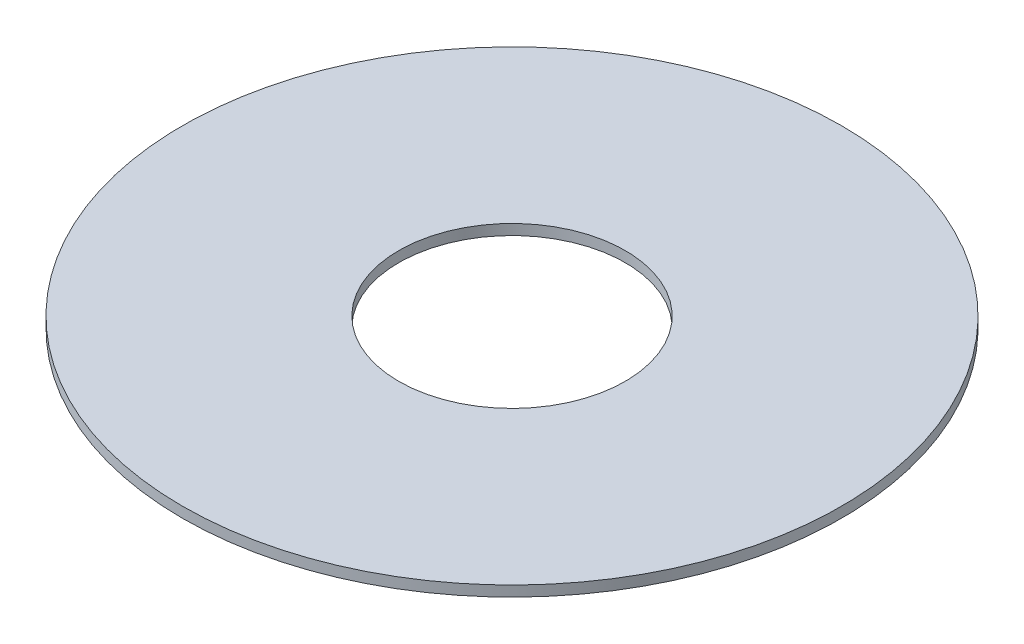
ISO-10303-21;
HEADER;
FILE_DESCRIPTION(('STEP AP214'),'2;1');
FILE_NAME('part.step','',(''),(''),'','','');
FILE_SCHEMA(('AUTOMOTIVE_DESIGN { 1 0 10303 214 1 1 1 1 }'));
ENDSEC;
DATA;
#1=APPLICATION_CONTEXT('core data for automotive mechanical design processes');
#2=APPLICATION_PROTOCOL_DEFINITION('international standard','automotive_design',2000,#1);
#3=PRODUCT_CONTEXT('',#1,'mechanical');
#4=PRODUCT('Part','Part','',(#3));
#5=PRODUCT_RELATED_PRODUCT_CATEGORY('part','',(#4));
#6=PRODUCT_DEFINITION_FORMATION('','',#4);
#7=PRODUCT_DEFINITION_CONTEXT('part definition',#1,'design');
#8=PRODUCT_DEFINITION('design','',#6,#7);
#9=PRODUCT_DEFINITION_SHAPE('','',#8);
#10=(LENGTH_UNIT() NAMED_UNIT(*) SI_UNIT(.MILLI.,.METRE.));
#11=(NAMED_UNIT(*) PLANE_ANGLE_UNIT() SI_UNIT($,.RADIAN.));
#12=(NAMED_UNIT(*) SI_UNIT($,.STERADIAN.) SOLID_ANGLE_UNIT());
#13=UNCERTAINTY_MEASURE_WITH_UNIT(LENGTH_MEASURE(1.E-05),#10,'distance_accuracy_value','');
#14=(GEOMETRIC_REPRESENTATION_CONTEXT(3) GLOBAL_UNCERTAINTY_ASSIGNED_CONTEXT((#13)) GLOBAL_UNIT_ASSIGNED_CONTEXT((#10,
#11,#12)) REPRESENTATION_CONTEXT('',''));
#15=CARTESIAN_POINT('',(0.,0.,0.));
#16=DIRECTION('',(0.,0.,1.));
#17=DIRECTION('',(1.,0.,0.));
#18=AXIS2_PLACEMENT_3D('',#15,#16,#17);
#19=CARTESIAN_POINT('',(29.458472739033,2.,-1.69765412213631));
#20=DIRECTION('',(0.,1.,0.));
#21=DIRECTION('',(0.,0.,1.));
#22=AXIS2_PLACEMENT_3D('',#19,#20,#21);
#23=PLANE('',#22);
#24=CARTESIAN_POINT('',(29.458472739033,2.,-1.69765412213631));
#25=DIRECTION('',(0.,1.,0.));
#26=DIRECTION('',(0.,0.,1.));
#27=AXIS2_PLACEMENT_3D('',#24,#25,#26);
#28=CIRCLE('',#27,62.8330061942196);
#29=CARTESIAN_POINT('',(29.458472739033,2.,61.1353520720833));
#30=VERTEX_POINT('',#29);
#31=EDGE_CURVE('E10',#30,#30,#28,.T.);
#32=ORIENTED_EDGE('',*,*,#31,.T.);
#33=EDGE_LOOP('',(#32));
#34=FACE_BOUND('',#33,.T.);
#35=CARTESIAN_POINT('',(29.458472739033,2.,-1.69765412213631));
#36=DIRECTION('',(0.,1.,0.));
#37=DIRECTION('',(0.,0.,1.));
#38=AXIS2_PLACEMENT_3D('',#35,#36,#37);
#39=CIRCLE('',#38,21.6);
#40=CARTESIAN_POINT('',(29.458472739033,2.,19.9023458778637));
#41=VERTEX_POINT('',#40);
#42=EDGE_CURVE('E44',#41,#41,#39,.T.);
#43=ORIENTED_EDGE('',*,*,#42,.F.);
#44=EDGE_LOOP('',(#43));
#45=FACE_BOUND('',#44,.T.);
#46=ADVANCED_FACE('F33',(#34,#45),#23,.T.);
#47=CARTESIAN_POINT('',(29.458472739033,0.,-1.69765412213631));
#48=DIRECTION('',(0.,1.,0.));
#49=DIRECTION('',(0.,0.,1.));
#50=AXIS2_PLACEMENT_3D('',#47,#48,#49);
#51=PLANE('',#50);
#52=CARTESIAN_POINT('',(29.458472739033,0.,-1.69765412213631));
#53=DIRECTION('',(0.,1.,0.));
#54=DIRECTION('',(0.,0.,1.));
#55=AXIS2_PLACEMENT_3D('',#52,#53,#54);
#56=CIRCLE('',#55,62.8330061942196);
#57=CARTESIAN_POINT('',(29.458472739033,0.,61.1353520720833));
#58=VERTEX_POINT('',#57);
#59=EDGE_CURVE('E37',#58,#58,#56,.T.);
#60=ORIENTED_EDGE('',*,*,#59,.F.);
#61=EDGE_LOOP('',(#60));
#62=FACE_BOUND('',#61,.T.);
#63=CARTESIAN_POINT('',(29.458472739033,0.,-1.69765412213631));
#64=DIRECTION('',(0.,1.,0.));
#65=DIRECTION('',(0.,0.,1.));
#66=AXIS2_PLACEMENT_3D('',#63,#64,#65);
#67=CIRCLE('',#66,21.6);
#68=CARTESIAN_POINT('',(29.458472739033,0.,19.9023458778637));
#69=VERTEX_POINT('',#68);
#70=EDGE_CURVE('E46',#69,#69,#67,.T.);
#71=ORIENTED_EDGE('',*,*,#70,.T.);
#72=EDGE_LOOP('',(#71));
#73=FACE_BOUND('',#72,.T.);
#74=ADVANCED_FACE('F56',(#62,#73),#51,.F.);
#75=CARTESIAN_POINT('',(29.458472739033,2.,-1.69765412213631));
#76=DIRECTION('',(0.,-1.,0.));
#77=DIRECTION('',(0.,0.,-1.));
#78=AXIS2_PLACEMENT_3D('',#75,#76,#77);
#79=CYLINDRICAL_SURFACE('',#78,62.8330061942196);
#80=ORIENTED_EDGE('',*,*,#31,.F.);
#81=EDGE_LOOP('',(#80));
#82=FACE_BOUND('',#81,.T.);
#83=ORIENTED_EDGE('',*,*,#59,.T.);
#84=EDGE_LOOP('',(#83));
#85=FACE_BOUND('',#84,.T.);
#86=ADVANCED_FACE('F35',(#82,#85),#79,.T.);
#87=CARTESIAN_POINT('',(29.458472739033,2.,-1.69765412213631));
#88=DIRECTION('',(0.,-1.,0.));
#89=DIRECTION('',(0.,0.,-1.));
#90=AXIS2_PLACEMENT_3D('',#87,#88,#89);
#91=CYLINDRICAL_SURFACE('',#90,21.6);
#92=ORIENTED_EDGE('',*,*,#42,.T.);
#93=EDGE_LOOP('',(#92));
#94=FACE_BOUND('',#93,.T.);
#95=ORIENTED_EDGE('',*,*,#70,.F.);
#96=EDGE_LOOP('',(#95));
#97=FACE_BOUND('',#96,.T.);
#98=ADVANCED_FACE('F52',(#94,#97),#91,.F.);
#99=CLOSED_SHELL('',(#46,#74,#86,#98));
#100=MANIFOLD_SOLID_BREP('B2',#99);
#101=ADVANCED_BREP_SHAPE_REPRESENTATION('',(#18,#100),#14);
#102=SHAPE_DEFINITION_REPRESENTATION(#9,#101);
ENDSEC;
END-ISO-10303-21;
